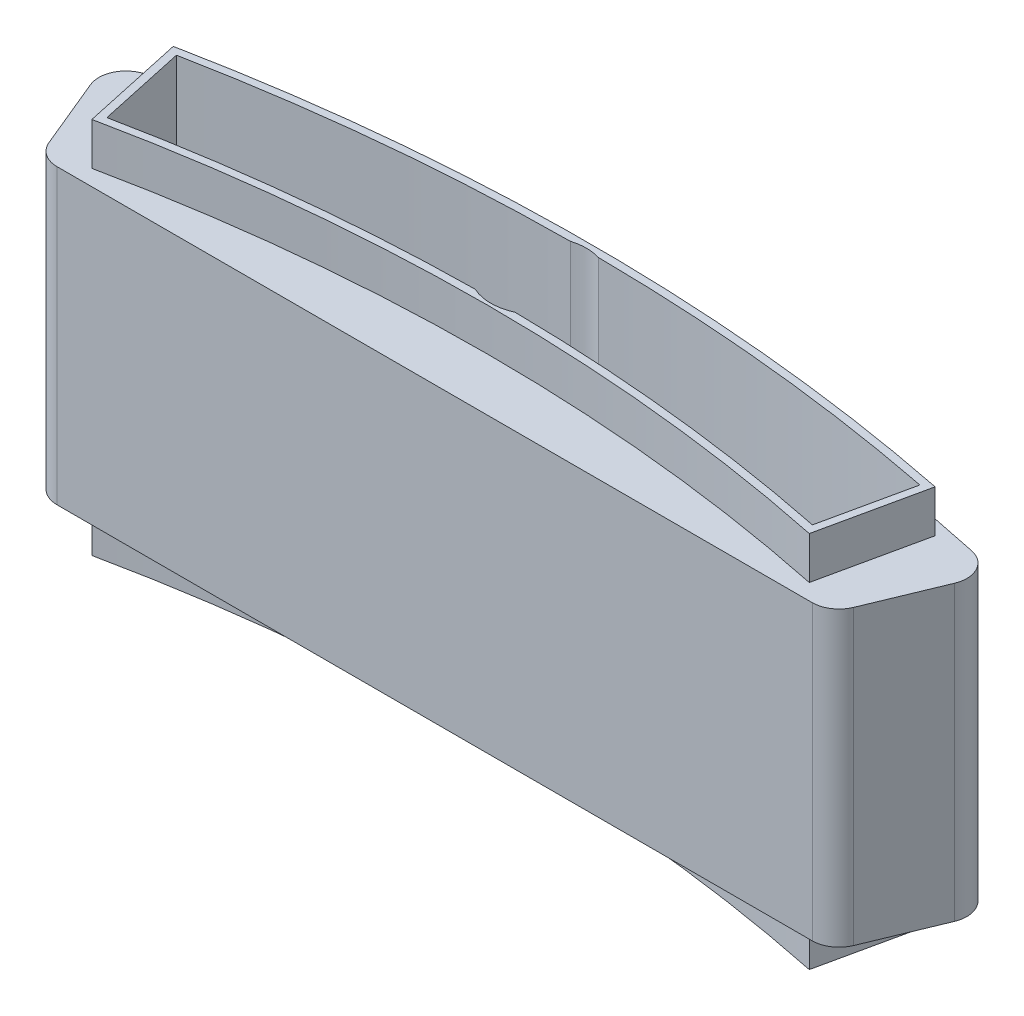
ISO-10303-21;
HEADER;
FILE_DESCRIPTION(('STEP AP214'),'2;1');
FILE_NAME('part.step','',(''),(''),'','','');
FILE_SCHEMA(('AUTOMOTIVE_DESIGN { 1 0 10303 214 1 1 1 1 }'));
ENDSEC;
DATA;
#1=APPLICATION_CONTEXT('core data for automotive mechanical design processes');
#2=APPLICATION_PROTOCOL_DEFINITION('international standard','automotive_design',2000,#1);
#3=PRODUCT_CONTEXT('',#1,'mechanical');
#4=PRODUCT('Part','Part','',(#3));
#5=PRODUCT_RELATED_PRODUCT_CATEGORY('part','',(#4));
#6=PRODUCT_DEFINITION_FORMATION('','',#4);
#7=PRODUCT_DEFINITION_CONTEXT('part definition',#1,'design');
#8=PRODUCT_DEFINITION('design','',#6,#7);
#9=PRODUCT_DEFINITION_SHAPE('','',#8);
#10=(LENGTH_UNIT() NAMED_UNIT(*) SI_UNIT(.MILLI.,.METRE.));
#11=(NAMED_UNIT(*) PLANE_ANGLE_UNIT() SI_UNIT($,.RADIAN.));
#12=(NAMED_UNIT(*) SI_UNIT($,.STERADIAN.) SOLID_ANGLE_UNIT());
#13=UNCERTAINTY_MEASURE_WITH_UNIT(LENGTH_MEASURE(1.E-05),#10,'distance_accuracy_value','');
#14=(GEOMETRIC_REPRESENTATION_CONTEXT(3) GLOBAL_UNCERTAINTY_ASSIGNED_CONTEXT((#13)) GLOBAL_UNIT_ASSIGNED_CONTEXT((#10,
#11,#12)) REPRESENTATION_CONTEXT('',''));
#15=CARTESIAN_POINT('',(0.,0.,0.));
#16=DIRECTION('',(0.,0.,1.));
#17=DIRECTION('',(1.,0.,0.));
#18=AXIS2_PLACEMENT_3D('',#15,#16,#17);
#19=CARTESIAN_POINT('',(0.0112802310692795,-66.8621962083156,115.964252200857));
#20=DIRECTION('',(0.,1.,0.));
#21=DIRECTION('',(0.,0.,1.));
#22=AXIS2_PLACEMENT_3D('',#19,#20,#21);
#23=CYLINDRICAL_SURFACE('',#22,114.5);
#24=CARTESIAN_POINT('',(0.0112802310692795,12.25,115.964252200857));
#25=DIRECTION('',(0.,1.,0.));
#26=DIRECTION('',(0.,0.,1.));
#27=AXIS2_PLACEMENT_3D('',#24,#25,#26);
#28=CIRCLE('',#27,114.5);
#29=CARTESIAN_POINT('',(-1.29322110112343,12.25,1.47168354998676));
#30=VERTEX_POINT('',#29);
#31=CARTESIAN_POINT('',(-22.8840681506865,12.25,3.77667257424252));
#32=VERTEX_POINT('',#31);
#33=EDGE_CURVE('E455',#30,#32,#28,.T.);
#34=ORIENTED_EDGE('',*,*,#33,.F.);
#35=DIRECTION('',(0.,1.,0.));
#36=VECTOR('',#35,1.);
#37=CARTESIAN_POINT('',(-1.29322110112356,0.,1.4716835499867));
#38=LINE('',#37,#36);
#39=CARTESIAN_POINT('',(-1.29322110112343,-12.25,1.47168354998676));
#40=VERTEX_POINT('',#39);
#41=EDGE_CURVE('E451',#30,#40,#38,.F.);
#42=ORIENTED_EDGE('',*,*,#41,.T.);
#43=CARTESIAN_POINT('',(0.0112802310692795,-12.25,115.964252200857));
#44=DIRECTION('',(0.,1.,0.));
#45=DIRECTION('',(0.,0.,1.));
#46=AXIS2_PLACEMENT_3D('',#43,#44,#45);
#47=CIRCLE('',#46,114.5);
#48=CARTESIAN_POINT('',(-22.8840681506865,-12.25,3.77667257424252));
#49=VERTEX_POINT('',#48);
#50=EDGE_CURVE('E224',#40,#49,#47,.T.);
#51=ORIENTED_EDGE('',*,*,#50,.T.);
#52=DIRECTION('',(0.,1.,0.));
#53=VECTOR('',#52,1.);
#54=CARTESIAN_POINT('',(-22.8840681506865,-66.8621962083156,3.77667257424252));
#55=LINE('',#54,#53);
#56=EDGE_CURVE('E303',#49,#32,#55,.T.);
#57=ORIENTED_EDGE('',*,*,#56,.T.);
#58=EDGE_LOOP('',(#34,#42,#51,#57));
#59=FACE_BOUND('',#58,.T.);
#60=ADVANCED_FACE('F34',(#59),#23,.T.);
#61=CARTESIAN_POINT('',(-0.0811563129540362,-66.8621962083156,121.187126411293));
#62=DIRECTION('',(0.,1.,0.));
#63=DIRECTION('',(0.,0.,1.));
#64=AXIS2_PLACEMENT_3D('',#61,#62,#63);
#65=CYLINDRICAL_SURFACE('',#64,125.5);
#66=CARTESIAN_POINT('',(-0.0811563129540362,-12.25,121.187126411293));
#67=DIRECTION('',(0.,-1.,0.));
#68=DIRECTION('',(0.,0.,-1.));
#69=AXIS2_PLACEMENT_3D('',#66,#67,#68);
#70=CIRCLE('',#69,125.5);
#71=CARTESIAN_POINT('',(-24.1352929641047,-12.25,-1.98611950667273));
#72=VERTEX_POINT('',#71);
#73=CARTESIAN_POINT('',(-0.906591410549388,-12.25,-4.31015904500499));
#74=VERTEX_POINT('',#73);
#75=EDGE_CURVE('E232',#72,#74,#70,.T.);
#76=ORIENTED_EDGE('',*,*,#75,.T.);
#77=DIRECTION('',(0.,1.,0.));
#78=VECTOR('',#77,1.);
#79=CARTESIAN_POINT('',(-0.906591410549032,0.,-4.31015904500509));
#80=LINE('',#79,#78);
#81=CARTESIAN_POINT('',(-0.906591410549388,12.25,-4.31015904500499));
#82=VERTEX_POINT('',#81);
#83=EDGE_CURVE('E11',#74,#82,#80,.T.);
#84=ORIENTED_EDGE('',*,*,#83,.T.);
#85=CARTESIAN_POINT('',(-0.0811563129540362,12.25,121.187126411293));
#86=DIRECTION('',(0.,-1.,0.));
#87=DIRECTION('',(0.,0.,-1.));
#88=AXIS2_PLACEMENT_3D('',#85,#86,#87);
#89=CIRCLE('',#88,125.5);
#90=CARTESIAN_POINT('',(-24.1352929641047,12.25,-1.98611950667273));
#91=VERTEX_POINT('',#90);
#92=EDGE_CURVE('E208',#91,#82,#89,.T.);
#93=ORIENTED_EDGE('',*,*,#92,.F.);
#94=DIRECTION('',(0.,1.,0.));
#95=VECTOR('',#94,1.);
#96=CARTESIAN_POINT('',(-24.1352929641047,-66.8621962083156,-1.98611950667273));
#97=LINE('',#96,#95);
#98=EDGE_CURVE('E306',#72,#91,#97,.T.);
#99=ORIENTED_EDGE('',*,*,#98,.F.);
#100=EDGE_LOOP('',(#76,#84,#93,#99));
#101=FACE_BOUND('',#100,.T.);
#102=ADVANCED_FACE('F415',(#101),#65,.F.);
#103=CARTESIAN_POINT('',(-26.4025099343969,9.5,-0.972403568799128));
#104=DIRECTION('',(0.,-1.,0.));
#105=DIRECTION('',(0.,0.,-1.));
#106=AXIS2_PLACEMENT_3D('',#103,#104,#105);
#107=PLANE('',#106);
#108=CARTESIAN_POINT('',(-26.4025099343969,9.5,-0.972403568799128));
#109=DIRECTION('',(0.,1.,0.));
#110=DIRECTION('',(0.,0.,-1.));
#111=AXIS2_PLACEMENT_3D('',#108,#109,#110);
#112=CIRCLE('',#111,1.75013946878296);
#113=CARTESIAN_POINT('',(-26.7737476597507,9.5,-2.68271661367309));
#114=VERTEX_POINT('',#113);
#115=CARTESIAN_POINT('',(-28.0194279686457,9.5,-0.302654189767656));
#116=VERTEX_POINT('',#115);
#117=EDGE_CURVE('E309',#114,#116,#112,.T.);
#118=ORIENTED_EDGE('',*,*,#117,.T.);
#119=DIRECTION('',(0.382683432365085,0.,0.923879532511289));
#120=VECTOR('',#119,1.);
#121=CARTESIAN_POINT('',(-28.0194279686457,9.5,-0.302654189767656));
#122=LINE('',#121,#120);
#123=CARTESIAN_POINT('',(-26.1060108068202,9.5,4.31674347278885));
#124=VERTEX_POINT('',#123);
#125=EDGE_CURVE('E312',#116,#124,#122,.T.);
#126=ORIENTED_EDGE('',*,*,#125,.T.);
#127=CARTESIAN_POINT('',(-24.4880554797441,9.5,3.64950384583466));
#128=DIRECTION('',(0.,1.,0.));
#129=DIRECTION('',(0.,0.,1.));
#130=AXIS2_PLACEMENT_3D('',#127,#128,#129);
#131=CIRCLE('',#130,1.75013946878297);
#132=CARTESIAN_POINT('',(-24.499999999997,9.5,5.39960255408739));
#133=VERTEX_POINT('',#132);
#134=EDGE_CURVE('E315',#124,#133,#131,.T.);
#135=ORIENTED_EDGE('',*,*,#134,.T.);
#136=DIRECTION('',(0.999999999999877,0.,-4.95547879286598E-07));
#137=VECTOR('',#136,1.);
#138=CARTESIAN_POINT('',(-24.499999999997,9.5,5.39960255408738));
#139=LINE('',#138,#137);
#140=CARTESIAN_POINT('',(24.499999999997,9.5,5.3995782722413));
#141=VERTEX_POINT('',#140);
#142=EDGE_CURVE('E317',#133,#141,#139,.T.);
#143=ORIENTED_EDGE('',*,*,#142,.T.);
#144=CARTESIAN_POINT('',(24.488086457616,9.5,3.64936289389924));
#145=DIRECTION('',(0.,1.,0.));
#146=DIRECTION('',(0.,0.,-1.));
#147=AXIS2_PLACEMENT_3D('',#144,#145,#146);
#148=CIRCLE('',#147,1.75025592502271);
#149=CARTESIAN_POINT('',(26.0981122813405,9.5,4.33581220012478));
#150=VERTEX_POINT('',#149);
#151=EDGE_CURVE('E319',#141,#150,#148,.T.);
#152=ORIENTED_EDGE('',*,*,#151,.T.);
#153=DIRECTION('',(0.382683432365086,0.,-0.923879532511288));
#154=VECTOR('',#153,1.);
#155=CARTESIAN_POINT('',(28.0194279686309,9.5,-0.30265418973194));
#156=LINE('',#155,#154);
#157=CARTESIAN_POINT('',(28.0194279686309,9.5,-0.30265418973194));
#158=VERTEX_POINT('',#157);
#159=EDGE_CURVE('E321',#150,#158,#156,.T.);
#160=ORIENTED_EDGE('',*,*,#159,.T.);
#161=CARTESIAN_POINT('',(26.4035459889238,9.5,-0.974899374058133));
#162=DIRECTION('',(0.,1.,0.));
#163=DIRECTION('',(0.,0.,-1.));
#164=AXIS2_PLACEMENT_3D('',#161,#162,#163);
#165=CIRCLE('',#164,1.75013946878295);
#166=CARTESIAN_POINT('',(26.7740328103203,9.5,-2.685375236315));
#167=VERTEX_POINT('',#166);
#168=EDGE_CURVE('E323',#158,#167,#165,.T.);
#169=ORIENTED_EDGE('',*,*,#168,.T.);
#170=CARTESIAN_POINT('',(0.00626825435491826,9.5,120.694320340698));
#171=DIRECTION('',(0.,1.,0.));
#172=DIRECTION('',(0.,0.,-1.));
#173=AXIS2_PLACEMENT_3D('',#170,#171,#172);
#174=CIRCLE('',#173,126.25);
#175=EDGE_CURVE('E325',#167,#114,#174,.T.);
#176=ORIENTED_EDGE('',*,*,#175,.T.);
#177=EDGE_LOOP('',(#118,#126,#135,#143,#152,#160,#169,#176));
#178=FACE_BOUND('',#177,.T.);
#179=CARTESIAN_POINT('',(-0.0811563129540362,9.5,121.187126411293));
#180=DIRECTION('',(0.,1.,0.));
#181=DIRECTION('',(0.,0.,1.));
#182=AXIS2_PLACEMENT_3D('',#179,#180,#181);
#183=CIRCLE('',#182,126.);
#184=CARTESIAN_POINT('',(24.7252633606687,9.5,-2.34684277522664));
#185=VERTEX_POINT('',#184);
#186=CARTESIAN_POINT('',(-24.732023244602,9.5,-2.37797691289828));
#187=VERTEX_POINT('',#186);
#188=EDGE_CURVE('E267',#185,#187,#183,.T.);
#189=ORIENTED_EDGE('',*,*,#188,.F.);
#190=DIRECTION('',(0.212177672156447,0.,-0.977231106462679));
#191=VECTOR('',#190,1.);
#192=CARTESIAN_POINT('',(23.2686614687517,9.5,4.36185877685812));
#193=LINE('',#192,#191);
#194=CARTESIAN_POINT('',(23.2686614687517,9.5,4.36185877685813));
#195=VERTEX_POINT('',#194);
#196=EDGE_CURVE('E272',#195,#185,#193,.T.);
#197=ORIENTED_EDGE('',*,*,#196,.F.);
#198=CARTESIAN_POINT('',(0.0112802310692795,9.5,115.964252200857));
#199=DIRECTION('',(0.,-1.,0.));
#200=DIRECTION('',(0.,0.,1.));
#201=AXIS2_PLACEMENT_3D('',#198,#199,#200);
#202=CIRCLE('',#201,114.);
#203=CARTESIAN_POINT('',(-23.2676844117722,9.5,4.36635882845832));
#204=VERTEX_POINT('',#203);
#205=EDGE_CURVE('E284',#204,#195,#202,.T.);
#206=ORIENTED_EDGE('',*,*,#205,.F.);
#207=DIRECTION('',(0.212177672156446,0.,0.977231106462679));
#208=VECTOR('',#207,1.);
#209=CARTESIAN_POINT('',(-24.732023244602,9.5,-2.37797691289828));
#210=LINE('',#209,#208);
#211=EDGE_CURVE('E281',#187,#204,#210,.T.);
#212=ORIENTED_EDGE('',*,*,#211,.F.);
#213=EDGE_LOOP('',(#189,#197,#206,#212));
#214=FACE_BOUND('',#213,.T.);
#215=ADVANCED_FACE('F389',(#178,#214),#107,.F.);
#216=CARTESIAN_POINT('',(-26.4025099343969,-9.5,-0.972403568799128));
#217=DIRECTION('',(0.,-1.,0.));
#218=DIRECTION('',(0.,0.,-1.));
#219=AXIS2_PLACEMENT_3D('',#216,#217,#218);
#220=PLANE('',#219);
#221=CARTESIAN_POINT('',(-0.0811563129540362,-9.5,121.187126411293));
#222=DIRECTION('',(0.,1.,0.));
#223=DIRECTION('',(0.,0.,1.));
#224=AXIS2_PLACEMENT_3D('',#221,#222,#223);
#225=CIRCLE('',#224,126.);
#226=CARTESIAN_POINT('',(24.7252633606687,-9.5,-2.34684277522664));
#227=VERTEX_POINT('',#226);
#228=CARTESIAN_POINT('',(-24.732023244602,-9.5,-2.37797691289828));
#229=VERTEX_POINT('',#228);
#230=EDGE_CURVE('E235',#227,#229,#225,.T.);
#231=ORIENTED_EDGE('',*,*,#230,.T.);
#232=DIRECTION('',(0.212177672156446,0.,0.977231106462679));
#233=VECTOR('',#232,1.);
#234=CARTESIAN_POINT('',(-24.732023244602,-9.5,-2.37797691289828));
#235=LINE('',#234,#233);
#236=CARTESIAN_POINT('',(-23.2676844117722,-9.5,4.36635882845832));
#237=VERTEX_POINT('',#236);
#238=EDGE_CURVE('E240',#229,#237,#235,.T.);
#239=ORIENTED_EDGE('',*,*,#238,.T.);
#240=CARTESIAN_POINT('',(0.0112802310692795,-9.5,115.964252200857));
#241=DIRECTION('',(0.,-1.,0.));
#242=DIRECTION('',(0.,0.,1.));
#243=AXIS2_PLACEMENT_3D('',#240,#241,#242);
#244=CIRCLE('',#243,114.);
#245=CARTESIAN_POINT('',(23.2686614687517,-9.5,4.36185877685812));
#246=VERTEX_POINT('',#245);
#247=EDGE_CURVE('E253',#237,#246,#244,.T.);
#248=ORIENTED_EDGE('',*,*,#247,.T.);
#249=DIRECTION('',(0.212177672156447,0.,-0.977231106462679));
#250=VECTOR('',#249,1.);
#251=CARTESIAN_POINT('',(23.2686614687517,-9.5,4.36185877685812));
#252=LINE('',#251,#250);
#253=EDGE_CURVE('E251',#246,#227,#252,.T.);
#254=ORIENTED_EDGE('',*,*,#253,.T.);
#255=EDGE_LOOP('',(#231,#239,#248,#254));
#256=FACE_BOUND('',#255,.T.);
#257=CARTESIAN_POINT('',(-26.4025099343969,-9.5,-0.972403568799128));
#258=DIRECTION('',(0.,1.,0.));
#259=DIRECTION('',(0.,0.,-1.));
#260=AXIS2_PLACEMENT_3D('',#257,#258,#259);
#261=CIRCLE('',#260,1.75013946878296);
#262=CARTESIAN_POINT('',(-26.7737476597507,-9.5,-2.68271661367309));
#263=VERTEX_POINT('',#262);
#264=CARTESIAN_POINT('',(-28.0194279686457,-9.5,-0.302654189767656));
#265=VERTEX_POINT('',#264);
#266=EDGE_CURVE('E308',#263,#265,#261,.T.);
#267=ORIENTED_EDGE('',*,*,#266,.F.);
#268=CARTESIAN_POINT('',(0.00626825435491826,-9.5,120.694320340698));
#269=DIRECTION('',(0.,1.,0.));
#270=DIRECTION('',(0.,0.,-1.));
#271=AXIS2_PLACEMENT_3D('',#268,#269,#270);
#272=CIRCLE('',#271,126.25);
#273=CARTESIAN_POINT('',(26.7740328103203,-9.5,-2.685375236315));
#274=VERTEX_POINT('',#273);
#275=EDGE_CURVE('E313',#274,#263,#272,.T.);
#276=ORIENTED_EDGE('',*,*,#275,.F.);
#277=CARTESIAN_POINT('',(26.4035459889238,-9.5,-0.974899374058133));
#278=DIRECTION('',(0.,1.,0.));
#279=DIRECTION('',(0.,0.,-1.));
#280=AXIS2_PLACEMENT_3D('',#277,#278,#279);
#281=CIRCLE('',#280,1.75013946878295);
#282=CARTESIAN_POINT('',(28.0194279686309,-9.5,-0.30265418973194));
#283=VERTEX_POINT('',#282);
#284=EDGE_CURVE('E340',#283,#274,#281,.T.);
#285=ORIENTED_EDGE('',*,*,#284,.F.);
#286=DIRECTION('',(0.382683432365086,0.,-0.923879532511288));
#287=VECTOR('',#286,1.);
#288=CARTESIAN_POINT('',(28.0194279686309,-9.5,-0.30265418973194));
#289=LINE('',#288,#287);
#290=CARTESIAN_POINT('',(26.0981122813405,-9.5,4.33581220012478));
#291=VERTEX_POINT('',#290);
#292=EDGE_CURVE('E338',#291,#283,#289,.T.);
#293=ORIENTED_EDGE('',*,*,#292,.F.);
#294=CARTESIAN_POINT('',(24.488086457616,-9.5,3.64936289389924));
#295=DIRECTION('',(0.,1.,0.));
#296=DIRECTION('',(0.,0.,-1.));
#297=AXIS2_PLACEMENT_3D('',#294,#295,#296);
#298=CIRCLE('',#297,1.75025592502271);
#299=CARTESIAN_POINT('',(24.499999999997,-9.5,5.3995782722413));
#300=VERTEX_POINT('',#299);
#301=EDGE_CURVE('E336',#300,#291,#298,.T.);
#302=ORIENTED_EDGE('',*,*,#301,.F.);
#303=DIRECTION('',(0.999999999999877,0.,-4.95547879286598E-07));
#304=VECTOR('',#303,1.);
#305=CARTESIAN_POINT('',(-24.499999999997,-9.5,5.39960255408738));
#306=LINE('',#305,#304);
#307=CARTESIAN_POINT('',(-24.499999999997,-9.5,5.39960255408739));
#308=VERTEX_POINT('',#307);
#309=EDGE_CURVE('E334',#308,#300,#306,.T.);
#310=ORIENTED_EDGE('',*,*,#309,.F.);
#311=CARTESIAN_POINT('',(-24.4880554797441,-9.5,3.64950384583466));
#312=DIRECTION('',(0.,1.,0.));
#313=DIRECTION('',(0.,0.,1.));
#314=AXIS2_PLACEMENT_3D('',#311,#312,#313);
#315=CIRCLE('',#314,1.75013946878297);
#316=CARTESIAN_POINT('',(-26.1060108068202,-9.5,4.31674347278885));
#317=VERTEX_POINT('',#316);
#318=EDGE_CURVE('E332',#317,#308,#315,.T.);
#319=ORIENTED_EDGE('',*,*,#318,.F.);
#320=DIRECTION('',(0.382683432365085,0.,0.923879532511289));
#321=VECTOR('',#320,1.);
#322=CARTESIAN_POINT('',(-28.0194279686457,-9.5,-0.302654189767656));
#323=LINE('',#322,#321);
#324=EDGE_CURVE('E330',#265,#317,#323,.T.);
#325=ORIENTED_EDGE('',*,*,#324,.F.);
#326=EDGE_LOOP('',(#267,#276,#285,#293,#302,#310,#319,#325));
#327=FACE_BOUND('',#326,.T.);
#328=ADVANCED_FACE('F374',(#256,#327),#220,.T.);
#329=CARTESIAN_POINT('',(-26.4025099343969,9.5,-0.972403568799128));
#330=DIRECTION('',(0.,-1.,0.));
#331=DIRECTION('',(0.,0.,-1.));
#332=AXIS2_PLACEMENT_3D('',#329,#330,#331);
#333=CYLINDRICAL_SURFACE('',#332,1.75013946878296);
#334=ORIENTED_EDGE('',*,*,#266,.T.);
#335=DIRECTION('',(0.,-1.,0.));
#336=VECTOR('',#335,1.);
#337=CARTESIAN_POINT('',(-28.0194279686457,9.5,-0.302654189767656));
#338=LINE('',#337,#336);
#339=EDGE_CURVE('E198',#116,#265,#338,.T.);
#340=ORIENTED_EDGE('',*,*,#339,.F.);
#341=ORIENTED_EDGE('',*,*,#117,.F.);
#342=DIRECTION('',(0.,-1.,0.));
#343=VECTOR('',#342,1.);
#344=CARTESIAN_POINT('',(-26.7737476597507,9.5,-2.68271661367309));
#345=LINE('',#344,#343);
#346=EDGE_CURVE('E327',#114,#263,#345,.T.);
#347=ORIENTED_EDGE('',*,*,#346,.T.);
#348=EDGE_LOOP('',(#334,#340,#341,#347));
#349=FACE_BOUND('',#348,.T.);
#350=ADVANCED_FACE('F36',(#349),#333,.T.);
#351=CARTESIAN_POINT('',(-28.0194279686457,9.5,-0.302654189767656));
#352=DIRECTION('',(0.923879532511289,0.,-0.382683432365085));
#353=DIRECTION('',(-0.382683432365085,0.,-0.923879532511289));
#354=AXIS2_PLACEMENT_3D('',#351,#352,#353);
#355=PLANE('',#354);
#356=ORIENTED_EDGE('',*,*,#324,.T.);
#357=DIRECTION('',(0.,-1.,0.));
#358=VECTOR('',#357,1.);
#359=CARTESIAN_POINT('',(-26.1060108068202,9.5,4.31674347278885));
#360=LINE('',#359,#358);
#361=EDGE_CURVE('E360',#124,#317,#360,.T.);
#362=ORIENTED_EDGE('',*,*,#361,.F.);
#363=ORIENTED_EDGE('',*,*,#125,.F.);
#364=ORIENTED_EDGE('',*,*,#339,.T.);
#365=EDGE_LOOP('',(#356,#362,#363,#364));
#366=FACE_BOUND('',#365,.T.);
#367=ADVANCED_FACE('F366',(#366),#355,.F.);
#368=CARTESIAN_POINT('',(-24.4880554797441,9.5,3.64950384583466));
#369=DIRECTION('',(0.,-1.,0.));
#370=DIRECTION('',(0.,0.,-1.));
#371=AXIS2_PLACEMENT_3D('',#368,#369,#370);
#372=CYLINDRICAL_SURFACE('',#371,1.75013946878297);
#373=ORIENTED_EDGE('',*,*,#318,.T.);
#374=DIRECTION('',(0.,-1.,0.));
#375=VECTOR('',#374,1.);
#376=CARTESIAN_POINT('',(-24.499999999997,9.5,5.39960255408739));
#377=LINE('',#376,#375);
#378=EDGE_CURVE('E357',#133,#308,#377,.T.);
#379=ORIENTED_EDGE('',*,*,#378,.F.);
#380=ORIENTED_EDGE('',*,*,#134,.F.);
#381=ORIENTED_EDGE('',*,*,#361,.T.);
#382=EDGE_LOOP('',(#373,#379,#380,#381));
#383=FACE_BOUND('',#382,.T.);
#384=ADVANCED_FACE('F381',(#383),#372,.T.);
#385=CARTESIAN_POINT('',(-24.499999999997,9.5,5.39960255408738));
#386=DIRECTION('',(-4.95547879286598E-07,0.,-0.999999999999877));
#387=DIRECTION('',(-0.999999999999877,0.,4.95547879286598E-07));
#388=AXIS2_PLACEMENT_3D('',#385,#386,#387);
#389=PLANE('',#388);
#390=ORIENTED_EDGE('',*,*,#309,.T.);
#391=DIRECTION('',(0.,-1.,0.));
#392=VECTOR('',#391,1.);
#393=CARTESIAN_POINT('',(24.499999999997,9.5,5.3995782722413));
#394=LINE('',#393,#392);
#395=EDGE_CURVE('E354',#141,#300,#394,.T.);
#396=ORIENTED_EDGE('',*,*,#395,.F.);
#397=ORIENTED_EDGE('',*,*,#142,.F.);
#398=ORIENTED_EDGE('',*,*,#378,.T.);
#399=EDGE_LOOP('',(#390,#396,#397,#398));
#400=FACE_BOUND('',#399,.T.);
#401=ADVANCED_FACE('F385',(#400),#389,.F.);
#402=CARTESIAN_POINT('',(24.488086457616,9.5,3.64936289389924));
#403=DIRECTION('',(0.,-1.,0.));
#404=DIRECTION('',(0.,0.,-1.));
#405=AXIS2_PLACEMENT_3D('',#402,#403,#404);
#406=CYLINDRICAL_SURFACE('',#405,1.75025592502271);
#407=ORIENTED_EDGE('',*,*,#301,.T.);
#408=DIRECTION('',(0.,-1.,0.));
#409=VECTOR('',#408,1.);
#410=CARTESIAN_POINT('',(26.0981122813405,9.5,4.33581220012478));
#411=LINE('',#410,#409);
#412=EDGE_CURVE('E351',#150,#291,#411,.T.);
#413=ORIENTED_EDGE('',*,*,#412,.F.);
#414=ORIENTED_EDGE('',*,*,#151,.F.);
#415=ORIENTED_EDGE('',*,*,#395,.T.);
#416=EDGE_LOOP('',(#407,#413,#414,#415));
#417=FACE_BOUND('',#416,.T.);
#418=ADVANCED_FACE('F405',(#417),#406,.T.);
#419=CARTESIAN_POINT('',(28.0194279686309,9.5,-0.30265418973194));
#420=DIRECTION('',(-0.923879532511289,0.,-0.382683432365086));
#421=DIRECTION('',(-0.382683432365086,0.,0.923879532511289));
#422=AXIS2_PLACEMENT_3D('',#419,#420,#421);
#423=PLANE('',#422);
#424=ORIENTED_EDGE('',*,*,#292,.T.);
#425=DIRECTION('',(0.,-1.,0.));
#426=VECTOR('',#425,1.);
#427=CARTESIAN_POINT('',(28.0194279686309,9.5,-0.30265418973194));
#428=LINE('',#427,#426);
#429=EDGE_CURVE('E348',#158,#283,#428,.T.);
#430=ORIENTED_EDGE('',*,*,#429,.F.);
#431=ORIENTED_EDGE('',*,*,#159,.F.);
#432=ORIENTED_EDGE('',*,*,#412,.T.);
#433=EDGE_LOOP('',(#424,#430,#431,#432));
#434=FACE_BOUND('',#433,.T.);
#435=ADVANCED_FACE('F402',(#434),#423,.F.);
#436=CARTESIAN_POINT('',(26.4035459889238,9.5,-0.974899374058133));
#437=DIRECTION('',(0.,-1.,0.));
#438=DIRECTION('',(0.,0.,-1.));
#439=AXIS2_PLACEMENT_3D('',#436,#437,#438);
#440=CYLINDRICAL_SURFACE('',#439,1.75013946878295);
#441=ORIENTED_EDGE('',*,*,#284,.T.);
#442=DIRECTION('',(0.,-1.,0.));
#443=VECTOR('',#442,1.);
#444=CARTESIAN_POINT('',(26.7740328103203,9.5,-2.685375236315));
#445=LINE('',#444,#443);
#446=EDGE_CURVE('E345',#167,#274,#445,.T.);
#447=ORIENTED_EDGE('',*,*,#446,.F.);
#448=ORIENTED_EDGE('',*,*,#168,.F.);
#449=ORIENTED_EDGE('',*,*,#429,.T.);
#450=EDGE_LOOP('',(#441,#447,#448,#449));
#451=FACE_BOUND('',#450,.T.);
#452=ADVANCED_FACE('F398',(#451),#440,.T.);
#453=CARTESIAN_POINT('',(0.00626825435491826,9.5,120.694320340698));
#454=DIRECTION('',(0.,-1.,0.));
#455=DIRECTION('',(0.,0.,-1.));
#456=AXIS2_PLACEMENT_3D('',#453,#454,#455);
#457=CYLINDRICAL_SURFACE('',#456,126.25);
#458=ORIENTED_EDGE('',*,*,#275,.T.);
#459=ORIENTED_EDGE('',*,*,#346,.F.);
#460=ORIENTED_EDGE('',*,*,#175,.F.);
#461=ORIENTED_EDGE('',*,*,#446,.T.);
#462=EDGE_LOOP('',(#458,#459,#460,#461));
#463=FACE_BOUND('',#462,.T.);
#464=ADVANCED_FACE('F396',(#463),#457,.T.);
#465=CARTESIAN_POINT('',(-0.0811563129540362,12.25,121.187126411293));
#466=DIRECTION('',(0.,1.,0.));
#467=DIRECTION('',(0.,0.,1.));
#468=AXIS2_PLACEMENT_3D('',#465,#466,#467);
#469=PLANE('',#468);
#470=CARTESIAN_POINT('',(0.,12.25,-1.34568742019255));
#471=DIRECTION('',(0.,1.,0.));
#472=DIRECTION('',(0.,0.,1.));
#473=AXIS2_PLACEMENT_3D('',#470,#471,#472);
#474=CIRCLE('',#473,3.1);
#475=CARTESIAN_POINT('',(0.910517489500135,12.25,-4.30895553180756));
#476=VERTEX_POINT('',#475);
#477=EDGE_CURVE('E194',#476,#82,#474,.T.);
#478=ORIENTED_EDGE('',*,*,#477,.F.);
#479=CARTESIAN_POINT('',(24.1286694127096,12.25,-1.95561327860055));
#480=VERTEX_POINT('',#479);
#481=EDGE_CURVE('E204',#476,#480,#89,.T.);
#482=ORIENTED_EDGE('',*,*,#481,.T.);
#483=DIRECTION('',(-0.212177672156447,0.,0.977231106462679));
#484=VECTOR('',#483,1.);
#485=CARTESIAN_POINT('',(24.1286694127096,12.25,-1.95561327860054));
#486=LINE('',#485,#484);
#487=CARTESIAN_POINT('',(22.8850249456471,12.25,3.77226584384373));
#488=VERTEX_POINT('',#487);
#489=EDGE_CURVE('E215',#480,#488,#486,.T.);
#490=ORIENTED_EDGE('',*,*,#489,.T.);
#491=CARTESIAN_POINT('',(1.29376289992804,12.25,1.47143479206055));
#492=VERTEX_POINT('',#491);
#493=EDGE_CURVE('E218',#488,#492,#28,.T.);
#494=ORIENTED_EDGE('',*,*,#493,.T.);
#495=EDGE_CURVE('E49',#30,#492,#474,.T.);
#496=ORIENTED_EDGE('',*,*,#495,.F.);
#497=ORIENTED_EDGE('',*,*,#33,.T.);
#498=DIRECTION('',(0.212177672156447,0.,0.977231106462679));
#499=VECTOR('',#498,1.);
#500=CARTESIAN_POINT('',(-24.1352929641047,12.25,-1.98611950667273));
#501=LINE('',#500,#499);
#502=EDGE_CURVE('E453',#91,#32,#501,.T.);
#503=ORIENTED_EDGE('',*,*,#502,.F.);
#504=ORIENTED_EDGE('',*,*,#92,.T.);
#505=EDGE_LOOP('',(#478,#482,#490,#494,#496,#497,#503,#504));
#506=FACE_BOUND('',#505,.T.);
#507=CARTESIAN_POINT('',(-0.0811563129540362,12.25,121.187126411293));
#508=DIRECTION('',(0.,1.,0.));
#509=DIRECTION('',(0.,0.,1.));
#510=AXIS2_PLACEMENT_3D('',#507,#508,#509);
#511=CIRCLE('',#510,126.);
#512=CARTESIAN_POINT('',(24.7252633606687,12.25,-2.34684277522664));
#513=VERTEX_POINT('',#512);
#514=CARTESIAN_POINT('',(-24.732023244602,12.25,-2.37797691289828));
#515=VERTEX_POINT('',#514);
#516=EDGE_CURVE('E268',#513,#515,#511,.T.);
#517=ORIENTED_EDGE('',*,*,#516,.T.);
#518=DIRECTION('',(0.212177672156446,0.,0.977231106462679));
#519=VECTOR('',#518,1.);
#520=CARTESIAN_POINT('',(-24.732023244602,12.25,-2.37797691289828));
#521=LINE('',#520,#519);
#522=CARTESIAN_POINT('',(-23.2676844117722,12.25,4.36635882845832));
#523=VERTEX_POINT('',#522);
#524=EDGE_CURVE('E271',#515,#523,#521,.T.);
#525=ORIENTED_EDGE('',*,*,#524,.T.);
#526=CARTESIAN_POINT('',(0.0112802310692795,12.25,115.964252200857));
#527=DIRECTION('',(0.,-1.,0.));
#528=DIRECTION('',(0.,0.,1.));
#529=AXIS2_PLACEMENT_3D('',#526,#527,#528);
#530=CIRCLE('',#529,114.);
#531=CARTESIAN_POINT('',(23.2686614687517,12.25,4.36185877685813));
#532=VERTEX_POINT('',#531);
#533=EDGE_CURVE('E274',#523,#532,#530,.T.);
#534=ORIENTED_EDGE('',*,*,#533,.T.);
#535=DIRECTION('',(0.212177672156447,0.,-0.977231106462679));
#536=VECTOR('',#535,1.);
#537=CARTESIAN_POINT('',(23.2686614687517,12.25,4.36185877685812));
#538=LINE('',#537,#536);
#539=EDGE_CURVE('E276',#532,#513,#538,.T.);
#540=ORIENTED_EDGE('',*,*,#539,.T.);
#541=EDGE_LOOP('',(#517,#525,#534,#540));
#542=FACE_BOUND('',#541,.T.);
#543=ADVANCED_FACE('F201',(#506,#542),#469,.T.);
#544=CARTESIAN_POINT('',(-0.0811563129540362,12.25,121.187126411293));
#545=DIRECTION('',(0.,-1.,0.));
#546=DIRECTION('',(0.,0.,-1.));
#547=AXIS2_PLACEMENT_3D('',#544,#545,#546);
#548=CYLINDRICAL_SURFACE('',#547,126.);
#549=ORIENTED_EDGE('',*,*,#188,.T.);
#550=DIRECTION('',(0.,-1.,0.));
#551=VECTOR('',#550,1.);
#552=CARTESIAN_POINT('',(-24.732023244602,12.25,-2.37797691289828));
#553=LINE('',#552,#551);
#554=EDGE_CURVE('E297',#515,#187,#553,.T.);
#555=ORIENTED_EDGE('',*,*,#554,.F.);
#556=ORIENTED_EDGE('',*,*,#516,.F.);
#557=DIRECTION('',(0.,-1.,0.));
#558=VECTOR('',#557,1.);
#559=CARTESIAN_POINT('',(24.7252633606687,12.25,-2.34684277522664));
#560=LINE('',#559,#558);
#561=EDGE_CURVE('E278',#513,#185,#560,.T.);
#562=ORIENTED_EDGE('',*,*,#561,.T.);
#563=EDGE_LOOP('',(#549,#555,#556,#562));
#564=FACE_BOUND('',#563,.T.);
#565=ADVANCED_FACE('F469',(#564),#548,.T.);
#566=CARTESIAN_POINT('',(-24.732023244602,12.25,-2.37797691289828));
#567=DIRECTION('',(0.977231106462679,0.,-0.212177672156446));
#568=DIRECTION('',(-0.212177672156446,0.,-0.977231106462679));
#569=AXIS2_PLACEMENT_3D('',#566,#567,#568);
#570=PLANE('',#569);
#571=ORIENTED_EDGE('',*,*,#211,.T.);
#572=DIRECTION('',(0.,-1.,0.));
#573=VECTOR('',#572,1.);
#574=CARTESIAN_POINT('',(-23.2676844117722,12.25,4.36635882845832));
#575=LINE('',#574,#573);
#576=EDGE_CURVE('E294',#523,#204,#575,.T.);
#577=ORIENTED_EDGE('',*,*,#576,.F.);
#578=ORIENTED_EDGE('',*,*,#524,.F.);
#579=ORIENTED_EDGE('',*,*,#554,.T.);
#580=EDGE_LOOP('',(#571,#577,#578,#579));
#581=FACE_BOUND('',#580,.T.);
#582=ADVANCED_FACE('F472',(#581),#570,.F.);
#583=CARTESIAN_POINT('',(0.0112802310692795,12.25,115.964252200857));
#584=DIRECTION('',(0.,-1.,0.));
#585=DIRECTION('',(0.,0.,-1.));
#586=AXIS2_PLACEMENT_3D('',#583,#584,#585);
#587=CYLINDRICAL_SURFACE('',#586,114.);
#588=ORIENTED_EDGE('',*,*,#205,.T.);
#589=DIRECTION('',(0.,-1.,0.));
#590=VECTOR('',#589,1.);
#591=CARTESIAN_POINT('',(23.2686614687517,12.25,4.36185877685813));
#592=LINE('',#591,#590);
#593=EDGE_CURVE('E291',#532,#195,#592,.T.);
#594=ORIENTED_EDGE('',*,*,#593,.F.);
#595=ORIENTED_EDGE('',*,*,#533,.F.);
#596=ORIENTED_EDGE('',*,*,#576,.T.);
#597=EDGE_LOOP('',(#588,#594,#595,#596));
#598=FACE_BOUND('',#597,.T.);
#599=ADVANCED_FACE('F476',(#598),#587,.F.);
#600=CARTESIAN_POINT('',(23.2686614687517,12.25,4.36185877685812));
#601=DIRECTION('',(-0.977231106462679,0.,-0.212177672156447));
#602=DIRECTION('',(-0.212177672156447,0.,0.977231106462679));
#603=AXIS2_PLACEMENT_3D('',#600,#601,#602);
#604=PLANE('',#603);
#605=ORIENTED_EDGE('',*,*,#196,.T.);
#606=ORIENTED_EDGE('',*,*,#561,.F.);
#607=ORIENTED_EDGE('',*,*,#539,.F.);
#608=ORIENTED_EDGE('',*,*,#593,.T.);
#609=EDGE_LOOP('',(#605,#606,#607,#608));
#610=FACE_BOUND('',#609,.T.);
#611=ADVANCED_FACE('F480',(#610),#604,.F.);
#612=CARTESIAN_POINT('',(-0.0811563129540362,-12.25,121.187126411293));
#613=DIRECTION('',(0.,1.,0.));
#614=DIRECTION('',(0.,0.,1.));
#615=AXIS2_PLACEMENT_3D('',#612,#613,#614);
#616=CYLINDRICAL_SURFACE('',#615,126.);
#617=ORIENTED_EDGE('',*,*,#230,.F.);
#618=DIRECTION('',(0.,1.,0.));
#619=VECTOR('',#618,1.);
#620=CARTESIAN_POINT('',(24.7252633606687,-12.25,-2.34684277522664));
#621=LINE('',#620,#619);
#622=CARTESIAN_POINT('',(24.7252633606687,-12.25,-2.34684277522664));
#623=VERTEX_POINT('',#622);
#624=EDGE_CURVE('E264',#623,#227,#621,.T.);
#625=ORIENTED_EDGE('',*,*,#624,.F.);
#626=CARTESIAN_POINT('',(-0.0811563129540362,-12.25,121.187126411293));
#627=DIRECTION('',(0.,1.,0.));
#628=DIRECTION('',(0.,0.,1.));
#629=AXIS2_PLACEMENT_3D('',#626,#627,#628);
#630=CIRCLE('',#629,126.);
#631=CARTESIAN_POINT('',(-24.732023244602,-12.25,-2.37797691289828));
#632=VERTEX_POINT('',#631);
#633=EDGE_CURVE('E236',#623,#632,#630,.T.);
#634=ORIENTED_EDGE('',*,*,#633,.T.);
#635=DIRECTION('',(0.,1.,0.));
#636=VECTOR('',#635,1.);
#637=CARTESIAN_POINT('',(-24.732023244602,-12.25,-2.37797691289828));
#638=LINE('',#637,#636);
#639=EDGE_CURVE('E249',#632,#229,#638,.T.);
#640=ORIENTED_EDGE('',*,*,#639,.T.);
#641=EDGE_LOOP('',(#617,#625,#634,#640));
#642=FACE_BOUND('',#641,.T.);
#643=ADVANCED_FACE('F484',(#642),#616,.T.);
#644=CARTESIAN_POINT('',(23.2686614687517,-12.25,4.36185877685812));
#645=DIRECTION('',(0.977231106462679,0.,0.212177672156447));
#646=DIRECTION('',(0.212177672156447,0.,-0.977231106462679));
#647=AXIS2_PLACEMENT_3D('',#644,#645,#646);
#648=PLANE('',#647);
#649=ORIENTED_EDGE('',*,*,#253,.F.);
#650=DIRECTION('',(0.,1.,0.));
#651=VECTOR('',#650,1.);
#652=CARTESIAN_POINT('',(23.2686614687517,-12.25,4.36185877685813));
#653=LINE('',#652,#651);
#654=CARTESIAN_POINT('',(23.2686614687517,-12.25,4.36185877685813));
#655=VERTEX_POINT('',#654);
#656=EDGE_CURVE('E261',#655,#246,#653,.T.);
#657=ORIENTED_EDGE('',*,*,#656,.F.);
#658=DIRECTION('',(0.212177672156447,0.,-0.977231106462679));
#659=VECTOR('',#658,1.);
#660=CARTESIAN_POINT('',(23.2686614687517,-12.25,4.36185877685812));
#661=LINE('',#660,#659);
#662=EDGE_CURVE('E239',#655,#623,#661,.T.);
#663=ORIENTED_EDGE('',*,*,#662,.T.);
#664=ORIENTED_EDGE('',*,*,#624,.T.);
#665=EDGE_LOOP('',(#649,#657,#663,#664));
#666=FACE_BOUND('',#665,.T.);
#667=ADVANCED_FACE('F490',(#666),#648,.T.);
#668=CARTESIAN_POINT('',(0.0112802310692795,-12.25,115.964252200857));
#669=DIRECTION('',(0.,1.,0.));
#670=DIRECTION('',(0.,0.,1.));
#671=AXIS2_PLACEMENT_3D('',#668,#669,#670);
#672=CYLINDRICAL_SURFACE('',#671,114.);
#673=ORIENTED_EDGE('',*,*,#247,.F.);
#674=DIRECTION('',(0.,1.,0.));
#675=VECTOR('',#674,1.);
#676=CARTESIAN_POINT('',(-23.2676844117722,-12.25,4.36635882845832));
#677=LINE('',#676,#675);
#678=CARTESIAN_POINT('',(-23.2676844117722,-12.25,4.36635882845832));
#679=VERTEX_POINT('',#678);
#680=EDGE_CURVE('E258',#679,#237,#677,.T.);
#681=ORIENTED_EDGE('',*,*,#680,.F.);
#682=CARTESIAN_POINT('',(0.0112802310692795,-12.25,115.964252200857));
#683=DIRECTION('',(0.,-1.,0.));
#684=DIRECTION('',(0.,0.,1.));
#685=AXIS2_PLACEMENT_3D('',#682,#683,#684);
#686=CIRCLE('',#685,114.);
#687=EDGE_CURVE('E243',#679,#655,#686,.T.);
#688=ORIENTED_EDGE('',*,*,#687,.T.);
#689=ORIENTED_EDGE('',*,*,#656,.T.);
#690=EDGE_LOOP('',(#673,#681,#688,#689));
#691=FACE_BOUND('',#690,.T.);
#692=ADVANCED_FACE('F494',(#691),#672,.F.);
#693=CARTESIAN_POINT('',(-24.732023244602,-12.25,-2.37797691289828));
#694=DIRECTION('',(-0.977231106462679,0.,0.212177672156446));
#695=DIRECTION('',(0.212177672156446,0.,0.977231106462679));
#696=AXIS2_PLACEMENT_3D('',#693,#694,#695);
#697=PLANE('',#696);
#698=ORIENTED_EDGE('',*,*,#238,.F.);
#699=ORIENTED_EDGE('',*,*,#639,.F.);
#700=DIRECTION('',(0.212177672156446,0.,0.977231106462679));
#701=VECTOR('',#700,1.);
#702=CARTESIAN_POINT('',(-24.732023244602,-12.25,-2.37797691289828));
#703=LINE('',#702,#701);
#704=EDGE_CURVE('E246',#632,#679,#703,.T.);
#705=ORIENTED_EDGE('',*,*,#704,.T.);
#706=ORIENTED_EDGE('',*,*,#680,.T.);
#707=EDGE_LOOP('',(#698,#699,#705,#706));
#708=FACE_BOUND('',#707,.T.);
#709=ADVANCED_FACE('F436',(#708),#697,.T.);
#710=CARTESIAN_POINT('',(-0.0811563129540362,-12.25,121.187126411293));
#711=DIRECTION('',(0.,-1.,0.));
#712=DIRECTION('',(0.,0.,1.));
#713=AXIS2_PLACEMENT_3D('',#710,#711,#712);
#714=PLANE('',#713);
#715=CARTESIAN_POINT('',(0.,-12.25,-1.34568742019255));
#716=DIRECTION('',(0.,1.,0.));
#717=DIRECTION('',(0.,0.,1.));
#718=AXIS2_PLACEMENT_3D('',#715,#716,#717);
#719=CIRCLE('',#718,3.1);
#720=CARTESIAN_POINT('',(1.29376289992804,-12.25,1.47143479206055));
#721=VERTEX_POINT('',#720);
#722=EDGE_CURVE('E209',#40,#721,#719,.T.);
#723=ORIENTED_EDGE('',*,*,#722,.T.);
#724=CARTESIAN_POINT('',(22.8850249456471,-12.25,3.7722658438437));
#725=VERTEX_POINT('',#724);
#726=EDGE_CURVE('E225',#725,#721,#47,.T.);
#727=ORIENTED_EDGE('',*,*,#726,.F.);
#728=DIRECTION('',(-0.212177672156447,0.,0.977231106462679));
#729=VECTOR('',#728,1.);
#730=CARTESIAN_POINT('',(24.1286694127096,-12.25,-1.95561327860054));
#731=LINE('',#730,#729);
#732=CARTESIAN_POINT('',(24.1286694127096,-12.25,-1.95561327860055));
#733=VERTEX_POINT('',#732);
#734=EDGE_CURVE('E228',#733,#725,#731,.T.);
#735=ORIENTED_EDGE('',*,*,#734,.F.);
#736=CARTESIAN_POINT('',(0.910517489500135,-12.25,-4.30895553180757));
#737=VERTEX_POINT('',#736);
#738=EDGE_CURVE('E231',#737,#733,#70,.T.);
#739=ORIENTED_EDGE('',*,*,#738,.F.);
#740=EDGE_CURVE('E57',#737,#74,#719,.T.);
#741=ORIENTED_EDGE('',*,*,#740,.T.);
#742=ORIENTED_EDGE('',*,*,#75,.F.);
#743=DIRECTION('',(0.212177672156447,0.,0.977231106462679));
#744=VECTOR('',#743,1.);
#745=CARTESIAN_POINT('',(-24.1352929641047,-12.25,-1.98611950667273));
#746=LINE('',#745,#744);
#747=EDGE_CURVE('E217',#72,#49,#746,.T.);
#748=ORIENTED_EDGE('',*,*,#747,.T.);
#749=ORIENTED_EDGE('',*,*,#50,.F.);
#750=EDGE_LOOP('',(#723,#727,#735,#739,#741,#742,#748,#749));
#751=FACE_BOUND('',#750,.T.);
#752=ORIENTED_EDGE('',*,*,#633,.F.);
#753=ORIENTED_EDGE('',*,*,#662,.F.);
#754=ORIENTED_EDGE('',*,*,#687,.F.);
#755=ORIENTED_EDGE('',*,*,#704,.F.);
#756=EDGE_LOOP('',(#752,#753,#754,#755));
#757=FACE_BOUND('',#756,.T.);
#758=ADVANCED_FACE('F429',(#751,#757),#714,.T.);
#759=ORIENTED_EDGE('',*,*,#726,.T.);
#760=DIRECTION('',(0.,1.,0.));
#761=VECTOR('',#760,1.);
#762=CARTESIAN_POINT('',(1.29376289992817,0.,1.47143479206049));
#763=LINE('',#762,#761);
#764=EDGE_CURVE('E441',#721,#492,#763,.T.);
#765=ORIENTED_EDGE('',*,*,#764,.T.);
#766=ORIENTED_EDGE('',*,*,#493,.F.);
#767=DIRECTION('',(0.,1.,0.));
#768=VECTOR('',#767,1.);
#769=CARTESIAN_POINT('',(22.8850249456471,-66.8621962083156,3.77226584384373));
#770=LINE('',#769,#768);
#771=EDGE_CURVE('E301',#725,#488,#770,.T.);
#772=ORIENTED_EDGE('',*,*,#771,.F.);
#773=EDGE_LOOP('',(#759,#765,#766,#772));
#774=FACE_BOUND('',#773,.T.);
#775=ADVANCED_FACE('F418',(#774),#23,.T.);
#776=CARTESIAN_POINT('',(24.1286694127096,-66.8621962083156,-1.95561327860054));
#777=DIRECTION('',(0.977231106462679,0.,0.212177672156447));
#778=DIRECTION('',(0.212177672156447,0.,-0.977231106462679));
#779=AXIS2_PLACEMENT_3D('',#776,#777,#778);
#780=PLANE('',#779);
#781=DIRECTION('',(0.,1.,0.));
#782=VECTOR('',#781,1.);
#783=CARTESIAN_POINT('',(24.1286694127096,-66.8621962083156,-1.95561327860054));
#784=LINE('',#783,#782);
#785=EDGE_CURVE('E213',#733,#480,#784,.T.);
#786=ORIENTED_EDGE('',*,*,#785,.F.);
#787=ORIENTED_EDGE('',*,*,#734,.T.);
#788=ORIENTED_EDGE('',*,*,#771,.T.);
#789=ORIENTED_EDGE('',*,*,#489,.F.);
#790=EDGE_LOOP('',(#786,#787,#788,#789));
#791=FACE_BOUND('',#790,.T.);
#792=ADVANCED_FACE('F428',(#791),#780,.F.);
#793=ORIENTED_EDGE('',*,*,#481,.F.);
#794=DIRECTION('',(0.,1.,0.));
#795=VECTOR('',#794,1.);
#796=CARTESIAN_POINT('',(0.910517489499774,0.,-4.30895553180767));
#797=LINE('',#796,#795);
#798=EDGE_CURVE('E42',#476,#737,#797,.F.);
#799=ORIENTED_EDGE('',*,*,#798,.T.);
#800=ORIENTED_EDGE('',*,*,#738,.T.);
#801=ORIENTED_EDGE('',*,*,#785,.T.);
#802=EDGE_LOOP('',(#793,#799,#800,#801));
#803=FACE_BOUND('',#802,.T.);
#804=ADVANCED_FACE('F211',(#803),#65,.F.);
#805=CARTESIAN_POINT('',(-24.1352929641047,-66.8621962083156,-1.98611950667273));
#806=DIRECTION('',(-0.977231106462679,0.,0.212177672156447));
#807=DIRECTION('',(0.212177672156447,0.,0.977231106462679));
#808=AXIS2_PLACEMENT_3D('',#805,#806,#807);
#809=PLANE('',#808);
#810=ORIENTED_EDGE('',*,*,#56,.F.);
#811=ORIENTED_EDGE('',*,*,#747,.F.);
#812=ORIENTED_EDGE('',*,*,#98,.T.);
#813=ORIENTED_EDGE('',*,*,#502,.T.);
#814=EDGE_LOOP('',(#810,#811,#812,#813));
#815=FACE_BOUND('',#814,.T.);
#816=ADVANCED_FACE('F459',(#815),#809,.F.);
#817=CARTESIAN_POINT('',(0.,-12.25,-1.34568742019255));
#818=DIRECTION('',(0.,1.,0.));
#819=DIRECTION('',(0.,0.,1.));
#820=AXIS2_PLACEMENT_3D('',#817,#818,#819);
#821=CYLINDRICAL_SURFACE('',#820,3.1);
#822=ORIENTED_EDGE('',*,*,#740,.F.);
#823=ORIENTED_EDGE('',*,*,#798,.F.);
#824=ORIENTED_EDGE('',*,*,#477,.T.);
#825=ORIENTED_EDGE('',*,*,#83,.F.);
#826=EDGE_LOOP('',(#822,#823,#824,#825));
#827=FACE_BOUND('',#826,.T.);
#828=ADVANCED_FACE('F193',(#827),#821,.F.);
#829=ORIENTED_EDGE('',*,*,#495,.T.);
#830=ORIENTED_EDGE('',*,*,#764,.F.);
#831=ORIENTED_EDGE('',*,*,#722,.F.);
#832=ORIENTED_EDGE('',*,*,#41,.F.);
#833=EDGE_LOOP('',(#829,#830,#831,#832));
#834=FACE_BOUND('',#833,.T.);
#835=ADVANCED_FACE('F466',(#834),#821,.F.);
#836=CLOSED_SHELL('',(#60,#102,#215,#328,#350,#367,#384,#401,#418,#435,#452,#464,#543,#565,#582,
#599,#611,#643,#667,#692,#709,#758,#775,#792,#804,#816,#828,#835));
#837=MANIFOLD_SOLID_BREP('B2',#836);
#838=ADVANCED_BREP_SHAPE_REPRESENTATION('',(#18,#837),#14);
#839=SHAPE_DEFINITION_REPRESENTATION(#9,#838);
ENDSEC;
END-ISO-10303-21;
